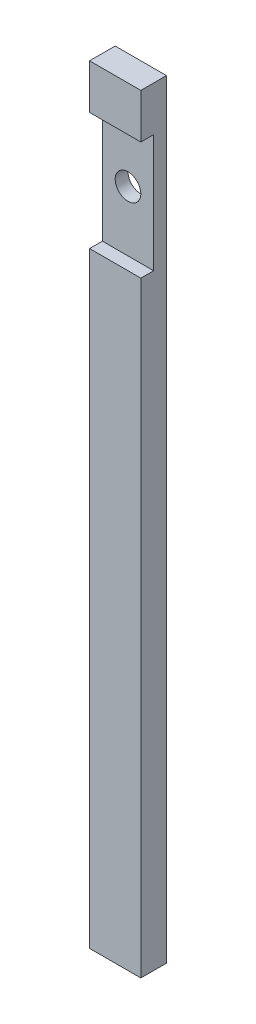
ISO-10303-21;
HEADER;
FILE_DESCRIPTION(('STEP AP214'),'2;1');
FILE_NAME('part.step','',(''),(''),'','','');
FILE_SCHEMA(('AUTOMOTIVE_DESIGN { 1 0 10303 214 1 1 1 1 }'));
ENDSEC;
DATA;
#1=APPLICATION_CONTEXT('core data for automotive mechanical design processes');
#2=APPLICATION_PROTOCOL_DEFINITION('international standard','automotive_design',2000,#1);
#3=PRODUCT_CONTEXT('',#1,'mechanical');
#4=PRODUCT('Part','Part','',(#3));
#5=PRODUCT_RELATED_PRODUCT_CATEGORY('part','',(#4));
#6=PRODUCT_DEFINITION_FORMATION('','',#4);
#7=PRODUCT_DEFINITION_CONTEXT('part definition',#1,'design');
#8=PRODUCT_DEFINITION('design','',#6,#7);
#9=PRODUCT_DEFINITION_SHAPE('','',#8);
#10=(LENGTH_UNIT() NAMED_UNIT(*) SI_UNIT(.MILLI.,.METRE.));
#11=(NAMED_UNIT(*) PLANE_ANGLE_UNIT() SI_UNIT($,.RADIAN.));
#12=(NAMED_UNIT(*) SI_UNIT($,.STERADIAN.) SOLID_ANGLE_UNIT());
#13=UNCERTAINTY_MEASURE_WITH_UNIT(LENGTH_MEASURE(1.E-05),#10,'distance_accuracy_value','');
#14=(GEOMETRIC_REPRESENTATION_CONTEXT(3) GLOBAL_UNCERTAINTY_ASSIGNED_CONTEXT((#13)) GLOBAL_UNIT_ASSIGNED_CONTEXT((#10,
#11,#12)) REPRESENTATION_CONTEXT('',''));
#15=CARTESIAN_POINT('',(0.,0.,0.));
#16=DIRECTION('',(0.,0.,1.));
#17=DIRECTION('',(1.,0.,0.));
#18=AXIS2_PLACEMENT_3D('',#15,#16,#17);
#19=CARTESIAN_POINT('',(0.,381.,0.));
#20=DIRECTION('',(0.,0.,-1.));
#21=DIRECTION('',(-1.,0.,0.));
#22=AXIS2_PLACEMENT_3D('',#19,#20,#21);
#23=PLANE('',#22);
#24=DIRECTION('',(1.,0.,0.));
#25=VECTOR('',#24,1.);
#26=CARTESIAN_POINT('',(0.,300.412531679498,0.));
#27=LINE('',#26,#25);
#28=CARTESIAN_POINT('',(0.,300.412531679498,0.));
#29=VERTEX_POINT('',#28);
#30=CARTESIAN_POINT('',(25.4,300.412531679498,0.));
#31=VERTEX_POINT('',#30);
#32=EDGE_CURVE('E185',#29,#31,#27,.T.);
#33=ORIENTED_EDGE('',*,*,#32,.F.);
#34=DIRECTION('',(0.,-1.,0.));
#35=VECTOR('',#34,1.);
#36=CARTESIAN_POINT('',(0.,381.,0.));
#37=LINE('',#36,#35);
#38=CARTESIAN_POINT('',(0.,0.,0.));
#39=VERTEX_POINT('',#38);
#40=EDGE_CURVE('E48',#29,#39,#37,.T.);
#41=ORIENTED_EDGE('',*,*,#40,.T.);
#42=DIRECTION('',(1.,0.,0.));
#43=VECTOR('',#42,1.);
#44=CARTESIAN_POINT('',(0.,0.,0.));
#45=LINE('',#44,#43);
#46=CARTESIAN_POINT('',(25.4,0.,0.));
#47=VERTEX_POINT('',#46);
#48=EDGE_CURVE('E151',#39,#47,#45,.T.);
#49=ORIENTED_EDGE('',*,*,#48,.T.);
#50=DIRECTION('',(0.,-1.,0.));
#51=VECTOR('',#50,1.);
#52=CARTESIAN_POINT('',(25.4,381.,0.));
#53=LINE('',#52,#51);
#54=EDGE_CURVE('E159',#31,#47,#53,.T.);
#55=ORIENTED_EDGE('',*,*,#54,.F.);
#56=EDGE_LOOP('',(#33,#41,#49,#55));
#57=FACE_BOUND('',#56,.T.);
#58=ADVANCED_FACE('F39',(#57),#23,.F.);
#59=DIRECTION('',(-1.,0.,0.));
#60=VECTOR('',#59,1.);
#61=CARTESIAN_POINT('',(0.,358.826959514045,0.));
#62=LINE('',#61,#60);
#63=CARTESIAN_POINT('',(25.4,358.826959514045,0.));
#64=VERTEX_POINT('',#63);
#65=CARTESIAN_POINT('',(0.,358.826959514045,0.));
#66=VERTEX_POINT('',#65);
#67=EDGE_CURVE('E129',#64,#66,#62,.T.);
#68=ORIENTED_EDGE('',*,*,#67,.F.);
#69=CARTESIAN_POINT('',(25.4,381.,0.));
#70=VERTEX_POINT('',#69);
#71=EDGE_CURVE('E161',#70,#64,#53,.T.);
#72=ORIENTED_EDGE('',*,*,#71,.F.);
#73=DIRECTION('',(1.,0.,0.));
#74=VECTOR('',#73,1.);
#75=CARTESIAN_POINT('',(0.,381.,0.));
#76=LINE('',#75,#74);
#77=CARTESIAN_POINT('',(0.,381.,0.));
#78=VERTEX_POINT('',#77);
#79=EDGE_CURVE('E95',#78,#70,#76,.T.);
#80=ORIENTED_EDGE('',*,*,#79,.F.);
#81=EDGE_CURVE('E11',#78,#66,#37,.T.);
#82=ORIENTED_EDGE('',*,*,#81,.T.);
#83=EDGE_LOOP('',(#68,#72,#80,#82));
#84=FACE_BOUND('',#83,.T.);
#85=ADVANCED_FACE('F180',(#84),#23,.F.);
#86=CARTESIAN_POINT('',(12.7,330.2,-12.7));
#87=DIRECTION('',(0.,0.,1.));
#88=DIRECTION('',(1.,0.,0.));
#89=AXIS2_PLACEMENT_3D('',#86,#87,#88);
#90=CYLINDRICAL_SURFACE('',#89,6.35);
#91=CARTESIAN_POINT('',(12.7,330.2,-12.7));
#92=DIRECTION('',(0.,0.,-1.));
#93=DIRECTION('',(-1.,0.,0.));
#94=AXIS2_PLACEMENT_3D('',#91,#92,#93);
#95=CIRCLE('',#94,6.35);
#96=CARTESIAN_POINT('',(6.35,330.2,-12.7));
#97=VERTEX_POINT('',#96);
#98=EDGE_CURVE('E138',#97,#97,#95,.T.);
#99=ORIENTED_EDGE('',*,*,#98,.T.);
#100=EDGE_LOOP('',(#99));
#101=FACE_BOUND('',#100,.T.);
#102=CARTESIAN_POINT('',(12.7,330.2,-6.35));
#103=DIRECTION('',(0.,0.,1.));
#104=DIRECTION('',(1.,0.,0.));
#105=AXIS2_PLACEMENT_3D('',#102,#103,#104);
#106=CIRCLE('',#105,6.35);
#107=CARTESIAN_POINT('',(19.05,330.2,-6.35));
#108=VERTEX_POINT('',#107);
#109=EDGE_CURVE('E43',#108,#108,#106,.T.);
#110=ORIENTED_EDGE('',*,*,#109,.T.);
#111=EDGE_LOOP('',(#110));
#112=FACE_BOUND('',#111,.T.);
#113=ADVANCED_FACE('F204',(#101,#112),#90,.F.);
#114=CARTESIAN_POINT('',(0.,381.,0.));
#115=DIRECTION('',(1.,0.,0.));
#116=DIRECTION('',(0.,0.,-1.));
#117=AXIS2_PLACEMENT_3D('',#114,#115,#116);
#118=PLANE('',#117);
#119=DIRECTION('',(0.,-1.,0.));
#120=VECTOR('',#119,1.);
#121=CARTESIAN_POINT('',(0.,358.826959514045,-6.35));
#122=LINE('',#121,#120);
#123=CARTESIAN_POINT('',(0.,358.826959514045,-6.35));
#124=VERTEX_POINT('',#123);
#125=CARTESIAN_POINT('',(0.,300.412531679498,-6.35));
#126=VERTEX_POINT('',#125);
#127=EDGE_CURVE('E117',#124,#126,#122,.T.);
#128=ORIENTED_EDGE('',*,*,#127,.F.);
#129=DIRECTION('',(0.,0.,1.));
#130=VECTOR('',#129,1.);
#131=CARTESIAN_POINT('',(0.,358.826959514045,-6.35));
#132=LINE('',#131,#130);
#133=EDGE_CURVE('E189',#124,#66,#132,.T.);
#134=ORIENTED_EDGE('',*,*,#133,.T.);
#135=ORIENTED_EDGE('',*,*,#81,.F.);
#136=DIRECTION('',(0.,0.,1.));
#137=VECTOR('',#136,1.);
#138=CARTESIAN_POINT('',(0.,381.,0.));
#139=LINE('',#138,#137);
#140=CARTESIAN_POINT('',(0.,381.,-12.7));
#141=VERTEX_POINT('',#140);
#142=EDGE_CURVE('E141',#141,#78,#139,.T.);
#143=ORIENTED_EDGE('',*,*,#142,.F.);
#144=DIRECTION('',(0.,-1.,0.));
#145=VECTOR('',#144,1.);
#146=CARTESIAN_POINT('',(0.,381.,-12.7));
#147=LINE('',#146,#145);
#148=CARTESIAN_POINT('',(0.,0.,-12.7));
#149=VERTEX_POINT('',#148);
#150=EDGE_CURVE('E149',#141,#149,#147,.T.);
#151=ORIENTED_EDGE('',*,*,#150,.T.);
#152=DIRECTION('',(0.,0.,1.));
#153=VECTOR('',#152,1.);
#154=CARTESIAN_POINT('',(0.,0.,0.));
#155=LINE('',#154,#153);
#156=EDGE_CURVE('E142',#149,#39,#155,.T.);
#157=ORIENTED_EDGE('',*,*,#156,.T.);
#158=ORIENTED_EDGE('',*,*,#40,.F.);
#159=DIRECTION('',(0.,0.,1.));
#160=VECTOR('',#159,1.);
#161=CARTESIAN_POINT('',(0.,300.412531679498,-6.35));
#162=LINE('',#161,#160);
#163=EDGE_CURVE('E111',#126,#29,#162,.T.);
#164=ORIENTED_EDGE('',*,*,#163,.F.);
#165=EDGE_LOOP('',(#128,#134,#135,#143,#151,#157,#158,#164));
#166=FACE_BOUND('',#165,.T.);
#167=ADVANCED_FACE('F41',(#166),#118,.F.);
#168=CARTESIAN_POINT('',(25.4,381.,0.));
#169=DIRECTION('',(-1.,0.,0.));
#170=DIRECTION('',(0.,0.,1.));
#171=AXIS2_PLACEMENT_3D('',#168,#169,#170);
#172=PLANE('',#171);
#173=DIRECTION('',(0.,1.,0.));
#174=VECTOR('',#173,1.);
#175=CARTESIAN_POINT('',(25.4,358.826959514045,-6.35));
#176=LINE('',#175,#174);
#177=CARTESIAN_POINT('',(25.4,300.412531679498,-6.35));
#178=VERTEX_POINT('',#177);
#179=CARTESIAN_POINT('',(25.4,358.826959514045,-6.35));
#180=VERTEX_POINT('',#179);
#181=EDGE_CURVE('E118',#178,#180,#176,.T.);
#182=ORIENTED_EDGE('',*,*,#181,.F.);
#183=DIRECTION('',(0.,0.,1.));
#184=VECTOR('',#183,1.);
#185=CARTESIAN_POINT('',(25.4,300.412531679498,-6.35));
#186=LINE('',#185,#184);
#187=EDGE_CURVE('E116',#178,#31,#186,.T.);
#188=ORIENTED_EDGE('',*,*,#187,.T.);
#189=ORIENTED_EDGE('',*,*,#54,.T.);
#190=DIRECTION('',(0.,0.,-1.));
#191=VECTOR('',#190,1.);
#192=CARTESIAN_POINT('',(25.4,0.,0.));
#193=LINE('',#192,#191);
#194=CARTESIAN_POINT('',(25.4,0.,-12.7));
#195=VERTEX_POINT('',#194);
#196=EDGE_CURVE('E152',#47,#195,#193,.T.);
#197=ORIENTED_EDGE('',*,*,#196,.T.);
#198=DIRECTION('',(0.,-1.,0.));
#199=VECTOR('',#198,1.);
#200=CARTESIAN_POINT('',(25.4,381.,-12.7));
#201=LINE('',#200,#199);
#202=CARTESIAN_POINT('',(25.4,381.,-12.7));
#203=VERTEX_POINT('',#202);
#204=EDGE_CURVE('E158',#203,#195,#201,.T.);
#205=ORIENTED_EDGE('',*,*,#204,.F.);
#206=DIRECTION('',(0.,0.,-1.));
#207=VECTOR('',#206,1.);
#208=CARTESIAN_POINT('',(25.4,381.,0.));
#209=LINE('',#208,#207);
#210=EDGE_CURVE('E148',#70,#203,#209,.T.);
#211=ORIENTED_EDGE('',*,*,#210,.F.);
#212=ORIENTED_EDGE('',*,*,#71,.T.);
#213=DIRECTION('',(0.,0.,1.));
#214=VECTOR('',#213,1.);
#215=CARTESIAN_POINT('',(25.4,358.826959514045,-6.35));
#216=LINE('',#215,#214);
#217=EDGE_CURVE('E133',#180,#64,#216,.T.);
#218=ORIENTED_EDGE('',*,*,#217,.F.);
#219=EDGE_LOOP('',(#182,#188,#189,#197,#205,#211,#212,#218));
#220=FACE_BOUND('',#219,.T.);
#221=ADVANCED_FACE('F170',(#220),#172,.F.);
#222=CARTESIAN_POINT('',(0.,381.,-12.7));
#223=DIRECTION('',(0.,0.,1.));
#224=DIRECTION('',(1.,0.,0.));
#225=AXIS2_PLACEMENT_3D('',#222,#223,#224);
#226=PLANE('',#225);
#227=ORIENTED_EDGE('',*,*,#98,.F.);
#228=EDGE_LOOP('',(#227));
#229=FACE_BOUND('',#228,.T.);
#230=DIRECTION('',(-1.,0.,0.));
#231=VECTOR('',#230,1.);
#232=CARTESIAN_POINT('',(0.,0.,-12.7));
#233=LINE('',#232,#231);
#234=EDGE_CURVE('E85',#195,#149,#233,.T.);
#235=ORIENTED_EDGE('',*,*,#234,.T.);
#236=ORIENTED_EDGE('',*,*,#150,.F.);
#237=DIRECTION('',(-1.,0.,0.));
#238=VECTOR('',#237,1.);
#239=CARTESIAN_POINT('',(0.,381.,-12.7));
#240=LINE('',#239,#238);
#241=EDGE_CURVE('E63',#203,#141,#240,.T.);
#242=ORIENTED_EDGE('',*,*,#241,.F.);
#243=ORIENTED_EDGE('',*,*,#204,.T.);
#244=EDGE_LOOP('',(#235,#236,#242,#243));
#245=FACE_BOUND('',#244,.T.);
#246=ADVANCED_FACE('F177',(#229,#245),#226,.F.);
#247=CARTESIAN_POINT('',(0.,381.,0.));
#248=DIRECTION('',(0.,-1.,0.));
#249=DIRECTION('',(0.,0.,-1.));
#250=AXIS2_PLACEMENT_3D('',#247,#248,#249);
#251=PLANE('',#250);
#252=ORIENTED_EDGE('',*,*,#142,.T.);
#253=ORIENTED_EDGE('',*,*,#79,.T.);
#254=ORIENTED_EDGE('',*,*,#210,.T.);
#255=ORIENTED_EDGE('',*,*,#241,.T.);
#256=EDGE_LOOP('',(#252,#253,#254,#255));
#257=FACE_BOUND('',#256,.T.);
#258=ADVANCED_FACE('F179',(#257),#251,.F.);
#259=CARTESIAN_POINT('',(0.,0.,0.));
#260=DIRECTION('',(0.,-1.,0.));
#261=DIRECTION('',(0.,0.,-1.));
#262=AXIS2_PLACEMENT_3D('',#259,#260,#261);
#263=PLANE('',#262);
#264=ORIENTED_EDGE('',*,*,#156,.F.);
#265=ORIENTED_EDGE('',*,*,#234,.F.);
#266=ORIENTED_EDGE('',*,*,#196,.F.);
#267=ORIENTED_EDGE('',*,*,#48,.F.);
#268=EDGE_LOOP('',(#264,#265,#266,#267));
#269=FACE_BOUND('',#268,.T.);
#270=ADVANCED_FACE('F173',(#269),#263,.T.);
#271=CARTESIAN_POINT('',(0.,358.826959514045,-6.35));
#272=DIRECTION('',(0.,1.,0.));
#273=DIRECTION('',(0.,0.,1.));
#274=AXIS2_PLACEMENT_3D('',#271,#272,#273);
#275=PLANE('',#274);
#276=ORIENTED_EDGE('',*,*,#67,.T.);
#277=ORIENTED_EDGE('',*,*,#133,.F.);
#278=DIRECTION('',(-1.,0.,0.));
#279=VECTOR('',#278,1.);
#280=CARTESIAN_POINT('',(0.,358.826959514045,-6.35));
#281=LINE('',#280,#279);
#282=EDGE_CURVE('E127',#180,#124,#281,.T.);
#283=ORIENTED_EDGE('',*,*,#282,.F.);
#284=ORIENTED_EDGE('',*,*,#217,.T.);
#285=EDGE_LOOP('',(#276,#277,#283,#284));
#286=FACE_BOUND('',#285,.T.);
#287=ADVANCED_FACE('F186',(#286),#275,.F.);
#288=CARTESIAN_POINT('',(0.,300.412531679498,-6.35));
#289=DIRECTION('',(0.,-1.,0.));
#290=DIRECTION('',(0.,0.,-1.));
#291=AXIS2_PLACEMENT_3D('',#288,#289,#290);
#292=PLANE('',#291);
#293=ORIENTED_EDGE('',*,*,#32,.T.);
#294=ORIENTED_EDGE('',*,*,#187,.F.);
#295=DIRECTION('',(1.,0.,0.));
#296=VECTOR('',#295,1.);
#297=CARTESIAN_POINT('',(0.,300.412531679498,-6.35));
#298=LINE('',#297,#296);
#299=EDGE_CURVE('E54',#126,#178,#298,.T.);
#300=ORIENTED_EDGE('',*,*,#299,.F.);
#301=ORIENTED_EDGE('',*,*,#163,.T.);
#302=EDGE_LOOP('',(#293,#294,#300,#301));
#303=FACE_BOUND('',#302,.T.);
#304=ADVANCED_FACE('F115',(#303),#292,.F.);
#305=CARTESIAN_POINT('',(0.,0.,-6.35));
#306=DIRECTION('',(0.,0.,1.));
#307=DIRECTION('',(1.,0.,0.));
#308=AXIS2_PLACEMENT_3D('',#305,#306,#307);
#309=PLANE('',#308);
#310=ORIENTED_EDGE('',*,*,#109,.F.);
#311=EDGE_LOOP('',(#310));
#312=FACE_BOUND('',#311,.T.);
#313=ORIENTED_EDGE('',*,*,#127,.T.);
#314=ORIENTED_EDGE('',*,*,#299,.T.);
#315=ORIENTED_EDGE('',*,*,#181,.T.);
#316=ORIENTED_EDGE('',*,*,#282,.T.);
#317=EDGE_LOOP('',(#313,#314,#315,#316));
#318=FACE_BOUND('',#317,.T.);
#319=ADVANCED_FACE('F123',(#312,#318),#309,.T.);
#320=CLOSED_SHELL('',(#58,#85,#113,#167,#221,#246,#258,#270,#287,#304,#319));
#321=MANIFOLD_SOLID_BREP('B2',#320);
#322=ADVANCED_BREP_SHAPE_REPRESENTATION('',(#18,#321),#14);
#323=SHAPE_DEFINITION_REPRESENTATION(#9,#322);
ENDSEC;
END-ISO-10303-21;
